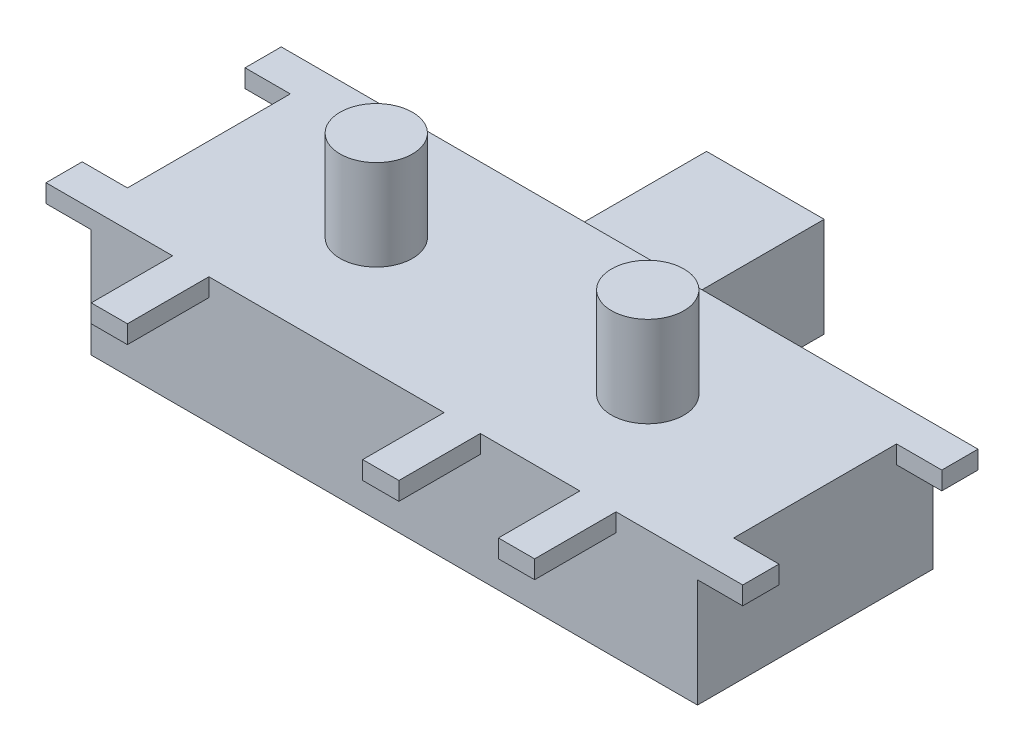
ISO-10303-21;
HEADER;
FILE_DESCRIPTION(('STEP AP214'),'2;1');
FILE_NAME('part.step','',(''),(''),'','','');
FILE_SCHEMA(('AUTOMOTIVE_DESIGN { 1 0 10303 214 1 1 1 1 }'));
ENDSEC;
DATA;
#1=APPLICATION_CONTEXT('core data for automotive mechanical design processes');
#2=APPLICATION_PROTOCOL_DEFINITION('international standard','automotive_design',2000,#1);
#3=PRODUCT_CONTEXT('',#1,'mechanical');
#4=PRODUCT('Part','Part','',(#3));
#5=PRODUCT_RELATED_PRODUCT_CATEGORY('part','',(#4));
#6=PRODUCT_DEFINITION_FORMATION('','',#4);
#7=PRODUCT_DEFINITION_CONTEXT('part definition',#1,'design');
#8=PRODUCT_DEFINITION('design','',#6,#7);
#9=PRODUCT_DEFINITION_SHAPE('','',#8);
#10=(LENGTH_UNIT() NAMED_UNIT(*) SI_UNIT(.MILLI.,.METRE.));
#11=(NAMED_UNIT(*) PLANE_ANGLE_UNIT() SI_UNIT($,.RADIAN.));
#12=(NAMED_UNIT(*) SI_UNIT($,.STERADIAN.) SOLID_ANGLE_UNIT());
#13=UNCERTAINTY_MEASURE_WITH_UNIT(LENGTH_MEASURE(1.E-05),#10,'distance_accuracy_value','');
#14=(GEOMETRIC_REPRESENTATION_CONTEXT(3) GLOBAL_UNCERTAINTY_ASSIGNED_CONTEXT((#13)) GLOBAL_UNIT_ASSIGNED_CONTEXT((#10,
#11,#12)) REPRESENTATION_CONTEXT('',''));
#15=CARTESIAN_POINT('',(0.,0.,0.));
#16=DIRECTION('',(0.,0.,1.));
#17=DIRECTION('',(1.,0.,0.));
#18=AXIS2_PLACEMENT_3D('',#15,#16,#17);
#19=CARTESIAN_POINT('',(0.,0.,-2.8));
#20=DIRECTION('',(0.,0.,-1.));
#21=DIRECTION('',(-1.,0.,0.));
#22=AXIS2_PLACEMENT_3D('',#19,#20,#21);
#23=PLANE('',#22);
#24=DIRECTION('',(0.,1.,0.));
#25=VECTOR('',#24,1.);
#26=CARTESIAN_POINT('',(-0.65,1.25,-2.8));
#27=LINE('',#26,#25);
#28=CARTESIAN_POINT('',(-0.65,0.15,-2.8));
#29=VERTEX_POINT('',#28);
#30=CARTESIAN_POINT('',(-0.65,1.25,-2.8));
#31=VERTEX_POINT('',#30);
#32=EDGE_CURVE('E223',#29,#31,#27,.T.);
#33=ORIENTED_EDGE('',*,*,#32,.T.);
#34=DIRECTION('',(1.,0.,0.));
#35=VECTOR('',#34,1.);
#36=CARTESIAN_POINT('',(0.65,1.25,-2.8));
#37=LINE('',#36,#35);
#38=CARTESIAN_POINT('',(0.65,1.25,-2.8));
#39=VERTEX_POINT('',#38);
#40=EDGE_CURVE('E246',#31,#39,#37,.T.);
#41=ORIENTED_EDGE('',*,*,#40,.T.);
#42=DIRECTION('',(0.,-1.,0.));
#43=VECTOR('',#42,1.);
#44=CARTESIAN_POINT('',(0.65,1.25,-2.8));
#45=LINE('',#44,#43);
#46=CARTESIAN_POINT('',(0.65,0.15,-2.8));
#47=VERTEX_POINT('',#46);
#48=EDGE_CURVE('E229',#39,#47,#45,.T.);
#49=ORIENTED_EDGE('',*,*,#48,.T.);
#50=DIRECTION('',(1.,0.,0.));
#51=VECTOR('',#50,1.);
#52=CARTESIAN_POINT('',(0.65,0.15,-2.8));
#53=LINE('',#52,#51);
#54=EDGE_CURVE('E226',#47,#29,#53,.F.);
#55=ORIENTED_EDGE('',*,*,#54,.T.);
#56=EDGE_LOOP('',(#33,#41,#49,#55));
#57=FACE_BOUND('',#56,.T.);
#58=ADVANCED_FACE('F17',(#57),#23,.T.);
#59=CARTESIAN_POINT('',(1.5,2.4,0.));
#60=DIRECTION('',(0.,1.,0.));
#61=DIRECTION('',(0.,0.,1.));
#62=AXIS2_PLACEMENT_3D('',#59,#60,#61);
#63=PLANE('',#62);
#64=CARTESIAN_POINT('',(1.5,2.4,0.));
#65=DIRECTION('',(0.,-1.,0.));
#66=DIRECTION('',(0.,0.,-1.));
#67=AXIS2_PLACEMENT_3D('',#64,#65,#66);
#68=CIRCLE('',#67,0.4);
#69=CARTESIAN_POINT('',(1.5,2.4,-0.4));
#70=VERTEX_POINT('',#69);
#71=EDGE_CURVE('E20',#70,#70,#68,.T.);
#72=ORIENTED_EDGE('',*,*,#71,.F.);
#73=EDGE_LOOP('',(#72));
#74=FACE_BOUND('',#73,.T.);
#75=ADVANCED_FACE('F848',(#74),#63,.T.);
#76=CARTESIAN_POINT('',(-1.5,2.4,0.));
#77=DIRECTION('',(0.,1.,0.));
#78=DIRECTION('',(0.,0.,1.));
#79=AXIS2_PLACEMENT_3D('',#76,#77,#78);
#80=PLANE('',#79);
#81=CARTESIAN_POINT('',(-1.5,2.4,0.));
#82=DIRECTION('',(0.,-1.,0.));
#83=DIRECTION('',(0.,0.,-1.));
#84=AXIS2_PLACEMENT_3D('',#81,#82,#83);
#85=CIRCLE('',#84,0.4);
#86=CARTESIAN_POINT('',(-1.5,2.4,-0.4));
#87=VERTEX_POINT('',#86);
#88=EDGE_CURVE('E257',#87,#87,#85,.T.);
#89=ORIENTED_EDGE('',*,*,#88,.F.);
#90=EDGE_LOOP('',(#89));
#91=FACE_BOUND('',#90,.T.);
#92=ADVANCED_FACE('F841',(#91),#80,.T.);
#93=CARTESIAN_POINT('',(0.,1.2,0.));
#94=DIRECTION('',(0.,1.,0.));
#95=DIRECTION('',(0.,0.,1.));
#96=AXIS2_PLACEMENT_3D('',#93,#94,#95);
#97=PLANE('',#96);
#98=DIRECTION('',(-1.,0.,0.));
#99=VECTOR('',#98,1.);
#100=CARTESIAN_POINT('',(-3.35,1.2,1.3));
#101=LINE('',#100,#99);
#102=CARTESIAN_POINT('',(-2.45,1.2,1.3));
#103=VERTEX_POINT('',#102);
#104=CARTESIAN_POINT('',(-2.05,1.2,1.3));
#105=VERTEX_POINT('',#104);
#106=EDGE_CURVE('E385',#103,#105,#101,.F.);
#107=ORIENTED_EDGE('',*,*,#106,.T.);
#108=DIRECTION('',(0.,0.,-1.));
#109=VECTOR('',#108,1.);
#110=CARTESIAN_POINT('',(-2.05,1.2,1.3));
#111=LINE('',#110,#109);
#112=CARTESIAN_POINT('',(-2.05,1.2,2.2));
#113=VERTEX_POINT('',#112);
#114=EDGE_CURVE('E398',#113,#105,#111,.T.);
#115=ORIENTED_EDGE('',*,*,#114,.F.);
#116=DIRECTION('',(1.,0.,0.));
#117=VECTOR('',#116,1.);
#118=CARTESIAN_POINT('',(-2.45,1.2,2.2));
#119=LINE('',#118,#117);
#120=CARTESIAN_POINT('',(-2.45,1.2,2.2));
#121=VERTEX_POINT('',#120);
#122=EDGE_CURVE('E404',#121,#113,#119,.T.);
#123=ORIENTED_EDGE('',*,*,#122,.F.);
#124=DIRECTION('',(0.,0.,1.));
#125=VECTOR('',#124,1.);
#126=CARTESIAN_POINT('',(-2.45,1.2,1.3));
#127=LINE('',#126,#125);
#128=EDGE_CURVE('E259',#103,#121,#127,.T.);
#129=ORIENTED_EDGE('',*,*,#128,.F.);
#130=EDGE_LOOP('',(#107,#115,#123,#129));
#131=FACE_BOUND('',#130,.T.);
#132=ADVANCED_FACE('F421',(#131),#97,.F.);
#133=CARTESIAN_POINT('',(0.,1.2,0.));
#134=DIRECTION('',(0.,1.,0.));
#135=DIRECTION('',(0.,0.,1.));
#136=AXIS2_PLACEMENT_3D('',#133,#134,#135);
#137=PLANE('',#136);
#138=DIRECTION('',(-1.,0.,0.));
#139=VECTOR('',#138,1.);
#140=CARTESIAN_POINT('',(-3.35,1.2,1.3));
#141=LINE('',#140,#139);
#142=CARTESIAN_POINT('',(0.55,1.2,1.3));
#143=VERTEX_POINT('',#142);
#144=CARTESIAN_POINT('',(0.95,1.2,1.3));
#145=VERTEX_POINT('',#144);
#146=EDGE_CURVE('E381',#143,#145,#141,.F.);
#147=ORIENTED_EDGE('',*,*,#146,.T.);
#148=DIRECTION('',(0.,0.,-1.));
#149=VECTOR('',#148,1.);
#150=CARTESIAN_POINT('',(0.95,1.2,1.3));
#151=LINE('',#150,#149);
#152=CARTESIAN_POINT('',(0.950000000000001,1.2,2.2));
#153=VERTEX_POINT('',#152);
#154=EDGE_CURVE('E361',#153,#145,#151,.T.);
#155=ORIENTED_EDGE('',*,*,#154,.F.);
#156=DIRECTION('',(1.,0.,0.));
#157=VECTOR('',#156,1.);
#158=CARTESIAN_POINT('',(0.55,1.2,2.2));
#159=LINE('',#158,#157);
#160=CARTESIAN_POINT('',(0.55,1.2,2.2));
#161=VERTEX_POINT('',#160);
#162=EDGE_CURVE('E367',#161,#153,#159,.T.);
#163=ORIENTED_EDGE('',*,*,#162,.F.);
#164=DIRECTION('',(0.,0.,1.));
#165=VECTOR('',#164,1.);
#166=CARTESIAN_POINT('',(0.55,1.2,1.3));
#167=LINE('',#166,#165);
#168=EDGE_CURVE('E372',#143,#161,#167,.T.);
#169=ORIENTED_EDGE('',*,*,#168,.F.);
#170=EDGE_LOOP('',(#147,#155,#163,#169));
#171=FACE_BOUND('',#170,.T.);
#172=ADVANCED_FACE('F621',(#171),#137,.F.);
#173=CARTESIAN_POINT('',(0.,1.2,0.));
#174=DIRECTION('',(0.,1.,0.));
#175=DIRECTION('',(0.,0.,1.));
#176=AXIS2_PLACEMENT_3D('',#173,#174,#175);
#177=PLANE('',#176);
#178=DIRECTION('',(-1.,0.,0.));
#179=VECTOR('',#178,1.);
#180=CARTESIAN_POINT('',(-3.35,1.2,1.3));
#181=LINE('',#180,#179);
#182=CARTESIAN_POINT('',(2.05,1.2,1.3));
#183=VERTEX_POINT('',#182);
#184=CARTESIAN_POINT('',(2.45,1.2,1.3));
#185=VERTEX_POINT('',#184);
#186=EDGE_CURVE('E377',#183,#185,#181,.F.);
#187=ORIENTED_EDGE('',*,*,#186,.T.);
#188=DIRECTION('',(0.,0.,-1.));
#189=VECTOR('',#188,1.);
#190=CARTESIAN_POINT('',(2.45,1.2,1.3));
#191=LINE('',#190,#189);
#192=CARTESIAN_POINT('',(2.45,1.2,2.2));
#193=VERTEX_POINT('',#192);
#194=EDGE_CURVE('E342',#193,#185,#191,.T.);
#195=ORIENTED_EDGE('',*,*,#194,.F.);
#196=DIRECTION('',(1.,0.,0.));
#197=VECTOR('',#196,1.);
#198=CARTESIAN_POINT('',(2.05,1.2,2.2));
#199=LINE('',#198,#197);
#200=CARTESIAN_POINT('',(2.05,1.2,2.2));
#201=VERTEX_POINT('',#200);
#202=EDGE_CURVE('E348',#201,#193,#199,.T.);
#203=ORIENTED_EDGE('',*,*,#202,.F.);
#204=DIRECTION('',(0.,0.,1.));
#205=VECTOR('',#204,1.);
#206=CARTESIAN_POINT('',(2.05,1.2,1.3));
#207=LINE('',#206,#205);
#208=EDGE_CURVE('E353',#183,#201,#207,.T.);
#209=ORIENTED_EDGE('',*,*,#208,.F.);
#210=EDGE_LOOP('',(#187,#195,#203,#209));
#211=FACE_BOUND('',#210,.T.);
#212=ADVANCED_FACE('F613',(#211),#177,.F.);
#213=CARTESIAN_POINT('',(0.,1.2,0.));
#214=DIRECTION('',(0.,-1.,0.));
#215=DIRECTION('',(0.,0.,-1.));
#216=AXIS2_PLACEMENT_3D('',#213,#214,#215);
#217=PLANE('',#216);
#218=DIRECTION('',(0.,0.,-1.));
#219=VECTOR('',#218,1.);
#220=CARTESIAN_POINT('',(3.85,1.2,1.3));
#221=LINE('',#220,#219);
#222=CARTESIAN_POINT('',(3.85,1.2,1.3));
#223=VERTEX_POINT('',#222);
#224=CARTESIAN_POINT('',(3.85,1.2,0.899999999999999));
#225=VERTEX_POINT('',#224);
#226=EDGE_CURVE('E334',#223,#225,#221,.T.);
#227=ORIENTED_EDGE('',*,*,#226,.F.);
#228=DIRECTION('',(-1.,0.,0.));
#229=VECTOR('',#228,1.);
#230=CARTESIAN_POINT('',(-3.35,1.2,1.3));
#231=LINE('',#230,#229);
#232=CARTESIAN_POINT('',(3.35,1.2,1.3));
#233=VERTEX_POINT('',#232);
#234=EDGE_CURVE('E394',#223,#233,#231,.T.);
#235=ORIENTED_EDGE('',*,*,#234,.T.);
#236=DIRECTION('',(0.,0.,1.));
#237=VECTOR('',#236,1.);
#238=CARTESIAN_POINT('',(3.35,1.2,-1.3));
#239=LINE('',#238,#237);
#240=CARTESIAN_POINT('',(3.35,1.2,0.899999999999999));
#241=VERTEX_POINT('',#240);
#242=EDGE_CURVE('E319',#233,#241,#239,.F.);
#243=ORIENTED_EDGE('',*,*,#242,.T.);
#244=DIRECTION('',(-1.,0.,0.));
#245=VECTOR('',#244,1.);
#246=CARTESIAN_POINT('',(3.35,1.2,0.899999999999999));
#247=LINE('',#246,#245);
#248=EDGE_CURVE('E328',#225,#241,#247,.T.);
#249=ORIENTED_EDGE('',*,*,#248,.F.);
#250=EDGE_LOOP('',(#227,#235,#243,#249));
#251=FACE_BOUND('',#250,.T.);
#252=ADVANCED_FACE('F611',(#251),#217,.T.);
#253=CARTESIAN_POINT('',(0.,1.2,0.));
#254=DIRECTION('',(0.,1.,0.));
#255=DIRECTION('',(0.,0.,1.));
#256=AXIS2_PLACEMENT_3D('',#253,#254,#255);
#257=PLANE('',#256);
#258=DIRECTION('',(1.,0.,0.));
#259=VECTOR('',#258,1.);
#260=CARTESIAN_POINT('',(-3.35,1.2,-1.3));
#261=LINE('',#260,#259);
#262=CARTESIAN_POINT('',(3.35,1.2,-1.3));
#263=VERTEX_POINT('',#262);
#264=CARTESIAN_POINT('',(3.85,1.2,-1.3));
#265=VERTEX_POINT('',#264);
#266=EDGE_CURVE('E301',#263,#265,#261,.T.);
#267=ORIENTED_EDGE('',*,*,#266,.T.);
#268=DIRECTION('',(0.,0.,-1.));
#269=VECTOR('',#268,1.);
#270=CARTESIAN_POINT('',(3.85,1.2,-1.3));
#271=LINE('',#270,#269);
#272=CARTESIAN_POINT('',(3.85,1.2,-0.900000000000001));
#273=VERTEX_POINT('',#272);
#274=EDGE_CURVE('E306',#273,#265,#271,.T.);
#275=ORIENTED_EDGE('',*,*,#274,.F.);
#276=DIRECTION('',(1.,0.,0.));
#277=VECTOR('',#276,1.);
#278=CARTESIAN_POINT('',(3.35,1.2,-0.900000000000001));
#279=LINE('',#278,#277);
#280=CARTESIAN_POINT('',(3.35,1.2,-0.900000000000001));
#281=VERTEX_POINT('',#280);
#282=EDGE_CURVE('E312',#281,#273,#279,.T.);
#283=ORIENTED_EDGE('',*,*,#282,.F.);
#284=DIRECTION('',(0.,0.,1.));
#285=VECTOR('',#284,1.);
#286=CARTESIAN_POINT('',(3.35,1.2,-1.3));
#287=LINE('',#286,#285);
#288=EDGE_CURVE('E326',#281,#263,#287,.F.);
#289=ORIENTED_EDGE('',*,*,#288,.T.);
#290=EDGE_LOOP('',(#267,#275,#283,#289));
#291=FACE_BOUND('',#290,.T.);
#292=ADVANCED_FACE('F592',(#291),#257,.F.);
#293=CARTESIAN_POINT('',(0.65,0.15,-2.8));
#294=DIRECTION('',(0.,1.,0.));
#295=DIRECTION('',(0.,0.,1.));
#296=AXIS2_PLACEMENT_3D('',#293,#294,#295);
#297=PLANE('',#296);
#298=DIRECTION('',(0.,0.,1.));
#299=VECTOR('',#298,1.);
#300=CARTESIAN_POINT('',(-0.65,0.15,-2.8));
#301=LINE('',#300,#299);
#302=CARTESIAN_POINT('',(-0.65,0.15,-1.3));
#303=VERTEX_POINT('',#302);
#304=EDGE_CURVE('E232',#303,#29,#301,.F.);
#305=ORIENTED_EDGE('',*,*,#304,.T.);
#306=ORIENTED_EDGE('',*,*,#54,.F.);
#307=DIRECTION('',(0.,0.,1.));
#308=VECTOR('',#307,1.);
#309=CARTESIAN_POINT('',(0.65,0.15,-2.8));
#310=LINE('',#309,#308);
#311=CARTESIAN_POINT('',(0.65,0.15,-1.3));
#312=VERTEX_POINT('',#311);
#313=EDGE_CURVE('E265',#47,#312,#310,.T.);
#314=ORIENTED_EDGE('',*,*,#313,.T.);
#315=DIRECTION('',(1.,0.,0.));
#316=VECTOR('',#315,1.);
#317=CARTESIAN_POINT('',(-3.35,0.15,-1.3));
#318=LINE('',#317,#316);
#319=EDGE_CURVE('E237',#312,#303,#318,.F.);
#320=ORIENTED_EDGE('',*,*,#319,.T.);
#321=EDGE_LOOP('',(#305,#306,#314,#320));
#322=FACE_BOUND('',#321,.T.);
#323=ADVANCED_FACE('F235',(#322),#297,.F.);
#324=CARTESIAN_POINT('',(-0.65,1.25,-2.8));
#325=DIRECTION('',(1.,0.,0.));
#326=DIRECTION('',(0.,1.,0.));
#327=AXIS2_PLACEMENT_3D('',#324,#325,#326);
#328=PLANE('',#327);
#329=DIRECTION('',(0.,0.,-1.));
#330=VECTOR('',#329,1.);
#331=CARTESIAN_POINT('',(-0.65,1.25,-2.8));
#332=LINE('',#331,#330);
#333=CARTESIAN_POINT('',(-0.65,1.25,-1.3));
#334=VERTEX_POINT('',#333);
#335=EDGE_CURVE('E243',#334,#31,#332,.T.);
#336=ORIENTED_EDGE('',*,*,#335,.T.);
#337=ORIENTED_EDGE('',*,*,#32,.F.);
#338=ORIENTED_EDGE('',*,*,#304,.F.);
#339=DIRECTION('',(0.,1.,0.));
#340=VECTOR('',#339,1.);
#341=CARTESIAN_POINT('',(-0.65,1.4,-1.3));
#342=LINE('',#341,#340);
#343=EDGE_CURVE('E289',#303,#334,#342,.T.);
#344=ORIENTED_EDGE('',*,*,#343,.T.);
#345=EDGE_LOOP('',(#336,#337,#338,#344));
#346=FACE_BOUND('',#345,.T.);
#347=ADVANCED_FACE('F241',(#346),#328,.F.);
#348=CARTESIAN_POINT('',(0.65,1.25,-2.8));
#349=DIRECTION('',(0.,-1.,0.));
#350=DIRECTION('',(0.,0.,-1.));
#351=AXIS2_PLACEMENT_3D('',#348,#349,#350);
#352=PLANE('',#351);
#353=DIRECTION('',(0.,0.,1.));
#354=VECTOR('',#353,1.);
#355=CARTESIAN_POINT('',(0.65,1.25,-2.8));
#356=LINE('',#355,#354);
#357=CARTESIAN_POINT('',(0.65,1.25,-1.3));
#358=VERTEX_POINT('',#357);
#359=EDGE_CURVE('E270',#358,#39,#356,.F.);
#360=ORIENTED_EDGE('',*,*,#359,.T.);
#361=ORIENTED_EDGE('',*,*,#40,.F.);
#362=ORIENTED_EDGE('',*,*,#335,.F.);
#363=DIRECTION('',(1.,0.,0.));
#364=VECTOR('',#363,1.);
#365=CARTESIAN_POINT('',(-3.35,1.25,-1.3));
#366=LINE('',#365,#364);
#367=EDGE_CURVE('E279',#334,#358,#366,.T.);
#368=ORIENTED_EDGE('',*,*,#367,.T.);
#369=EDGE_LOOP('',(#360,#361,#362,#368));
#370=FACE_BOUND('',#369,.T.);
#371=ADVANCED_FACE('F277',(#370),#352,.F.);
#372=CARTESIAN_POINT('',(0.65,1.25,-2.8));
#373=DIRECTION('',(-1.,0.,0.));
#374=DIRECTION('',(0.,-1.,0.));
#375=AXIS2_PLACEMENT_3D('',#372,#373,#374);
#376=PLANE('',#375);
#377=ORIENTED_EDGE('',*,*,#313,.F.);
#378=ORIENTED_EDGE('',*,*,#48,.F.);
#379=ORIENTED_EDGE('',*,*,#359,.F.);
#380=DIRECTION('',(0.,1.,0.));
#381=VECTOR('',#380,1.);
#382=CARTESIAN_POINT('',(0.65,1.4,-1.3));
#383=LINE('',#382,#381);
#384=EDGE_CURVE('E283',#358,#312,#383,.F.);
#385=ORIENTED_EDGE('',*,*,#384,.T.);
#386=EDGE_LOOP('',(#377,#378,#379,#385));
#387=FACE_BOUND('',#386,.T.);
#388=ADVANCED_FACE('F282',(#387),#376,.F.);
#389=CARTESIAN_POINT('',(0.,0.,0.));
#390=DIRECTION('',(0.,1.,0.));
#391=DIRECTION('',(0.,0.,1.));
#392=AXIS2_PLACEMENT_3D('',#389,#390,#391);
#393=PLANE('',#392);
#394=DIRECTION('',(-1.,0.,0.));
#395=VECTOR('',#394,1.);
#396=CARTESIAN_POINT('',(-3.35,0.,1.3));
#397=LINE('',#396,#395);
#398=CARTESIAN_POINT('',(3.35,0.,1.3));
#399=VERTEX_POINT('',#398);
#400=CARTESIAN_POINT('',(-3.35,0.,1.3));
#401=VERTEX_POINT('',#400);
#402=EDGE_CURVE('E392',#399,#401,#397,.T.);
#403=ORIENTED_EDGE('',*,*,#402,.T.);
#404=DIRECTION('',(0.,0.,-1.));
#405=VECTOR('',#404,1.);
#406=CARTESIAN_POINT('',(-3.35,0.,-1.3));
#407=LINE('',#406,#405);
#408=CARTESIAN_POINT('',(-3.35,0.,-1.3));
#409=VERTEX_POINT('',#408);
#410=EDGE_CURVE('E462',#401,#409,#407,.T.);
#411=ORIENTED_EDGE('',*,*,#410,.T.);
#412=DIRECTION('',(1.,0.,0.));
#413=VECTOR('',#412,1.);
#414=CARTESIAN_POINT('',(-3.35,0.,-1.3));
#415=LINE('',#414,#413);
#416=CARTESIAN_POINT('',(3.35,0.,-1.3));
#417=VERTEX_POINT('',#416);
#418=EDGE_CURVE('E290',#409,#417,#415,.T.);
#419=ORIENTED_EDGE('',*,*,#418,.T.);
#420=DIRECTION('',(0.,0.,1.));
#421=VECTOR('',#420,1.);
#422=CARTESIAN_POINT('',(3.35,0.,-1.3));
#423=LINE('',#422,#421);
#424=EDGE_CURVE('E324',#417,#399,#423,.T.);
#425=ORIENTED_EDGE('',*,*,#424,.T.);
#426=EDGE_LOOP('',(#403,#411,#419,#425));
#427=FACE_BOUND('',#426,.T.);
#428=ADVANCED_FACE('F596',(#427),#393,.F.);
#429=CARTESIAN_POINT('',(0.,1.2,0.));
#430=DIRECTION('',(0.,-1.,0.));
#431=DIRECTION('',(0.,0.,-1.));
#432=AXIS2_PLACEMENT_3D('',#429,#430,#431);
#433=PLANE('',#432);
#434=DIRECTION('',(0.,0.,1.));
#435=VECTOR('',#434,1.);
#436=CARTESIAN_POINT('',(-3.85,1.2,-1.3));
#437=LINE('',#436,#435);
#438=CARTESIAN_POINT('',(-3.85,1.2,-1.3));
#439=VERTEX_POINT('',#438);
#440=CARTESIAN_POINT('',(-3.85,1.2,-0.9));
#441=VERTEX_POINT('',#440);
#442=EDGE_CURVE('E473',#439,#441,#437,.T.);
#443=ORIENTED_EDGE('',*,*,#442,.F.);
#444=DIRECTION('',(1.,0.,0.));
#445=VECTOR('',#444,1.);
#446=CARTESIAN_POINT('',(-3.35,1.2,-1.3));
#447=LINE('',#446,#445);
#448=CARTESIAN_POINT('',(-3.35,1.2,-1.3));
#449=VERTEX_POINT('',#448);
#450=EDGE_CURVE('E294',#439,#449,#447,.T.);
#451=ORIENTED_EDGE('',*,*,#450,.T.);
#452=DIRECTION('',(0.,0.,-1.));
#453=VECTOR('',#452,1.);
#454=CARTESIAN_POINT('',(-3.35,1.2,-1.3));
#455=LINE('',#454,#453);
#456=CARTESIAN_POINT('',(-3.35,1.2,-0.9));
#457=VERTEX_POINT('',#456);
#458=EDGE_CURVE('E457',#449,#457,#455,.F.);
#459=ORIENTED_EDGE('',*,*,#458,.T.);
#460=DIRECTION('',(1.,0.,0.));
#461=VECTOR('',#460,1.);
#462=CARTESIAN_POINT('',(-3.35,1.2,-0.9));
#463=LINE('',#462,#461);
#464=EDGE_CURVE('E467',#441,#457,#463,.T.);
#465=ORIENTED_EDGE('',*,*,#464,.F.);
#466=EDGE_LOOP('',(#443,#451,#459,#465));
#467=FACE_BOUND('',#466,.T.);
#468=ADVANCED_FACE('F492',(#467),#433,.T.);
#469=CARTESIAN_POINT('',(0.,1.2,0.));
#470=DIRECTION('',(0.,1.,0.));
#471=DIRECTION('',(0.,0.,1.));
#472=AXIS2_PLACEMENT_3D('',#469,#470,#471);
#473=PLANE('',#472);
#474=DIRECTION('',(-1.,0.,0.));
#475=VECTOR('',#474,1.);
#476=CARTESIAN_POINT('',(-3.35,1.2,1.3));
#477=LINE('',#476,#475);
#478=CARTESIAN_POINT('',(-3.35,1.2,1.3));
#479=VERTEX_POINT('',#478);
#480=CARTESIAN_POINT('',(-3.85,1.2,1.3));
#481=VERTEX_POINT('',#480);
#482=EDGE_CURVE('E390',#479,#481,#477,.T.);
#483=ORIENTED_EDGE('',*,*,#482,.T.);
#484=DIRECTION('',(0.,0.,1.));
#485=VECTOR('',#484,1.);
#486=CARTESIAN_POINT('',(-3.85,1.2,1.3));
#487=LINE('',#486,#485);
#488=CARTESIAN_POINT('',(-3.85,1.2,0.899999999999999));
#489=VERTEX_POINT('',#488);
#490=EDGE_CURVE('E443',#489,#481,#487,.T.);
#491=ORIENTED_EDGE('',*,*,#490,.F.);
#492=DIRECTION('',(-1.,0.,0.));
#493=VECTOR('',#492,1.);
#494=CARTESIAN_POINT('',(-3.35,1.2,0.899999999999999));
#495=LINE('',#494,#493);
#496=CARTESIAN_POINT('',(-3.35,1.2,0.899999999999999));
#497=VERTEX_POINT('',#496);
#498=EDGE_CURVE('E447',#497,#489,#495,.T.);
#499=ORIENTED_EDGE('',*,*,#498,.F.);
#500=DIRECTION('',(0.,0.,-1.));
#501=VECTOR('',#500,1.);
#502=CARTESIAN_POINT('',(-3.35,1.2,-1.3));
#503=LINE('',#502,#501);
#504=EDGE_CURVE('E452',#497,#479,#503,.F.);
#505=ORIENTED_EDGE('',*,*,#504,.T.);
#506=EDGE_LOOP('',(#483,#491,#499,#505));
#507=FACE_BOUND('',#506,.T.);
#508=ADVANCED_FACE('F606',(#507),#473,.F.);
#509=CARTESIAN_POINT('',(1.5,2.4,0.));
#510=DIRECTION('',(0.,-1.,0.));
#511=DIRECTION('',(0.,0.,-1.));
#512=AXIS2_PLACEMENT_3D('',#509,#510,#511);
#513=CYLINDRICAL_SURFACE('',#512,0.4);
#514=CARTESIAN_POINT('',(1.5,1.4,0.));
#515=DIRECTION('',(0.,-1.,0.));
#516=DIRECTION('',(0.,0.,-1.));
#517=AXIS2_PLACEMENT_3D('',#514,#515,#516);
#518=CIRCLE('',#517,0.4);
#519=CARTESIAN_POINT('',(1.5,1.4,-0.4));
#520=VERTEX_POINT('',#519);
#521=EDGE_CURVE('E254',#520,#520,#518,.T.);
#522=ORIENTED_EDGE('',*,*,#521,.F.);
#523=EDGE_LOOP('',(#522));
#524=FACE_BOUND('',#523,.T.);
#525=ORIENTED_EDGE('',*,*,#71,.T.);
#526=EDGE_LOOP('',(#525));
#527=FACE_BOUND('',#526,.T.);
#528=ADVANCED_FACE('F674',(#524,#527),#513,.T.);
#529=CARTESIAN_POINT('',(-1.5,2.4,0.));
#530=DIRECTION('',(0.,-1.,0.));
#531=DIRECTION('',(0.,0.,-1.));
#532=AXIS2_PLACEMENT_3D('',#529,#530,#531);
#533=CYLINDRICAL_SURFACE('',#532,0.4);
#534=CARTESIAN_POINT('',(-1.5,1.4,0.));
#535=DIRECTION('',(0.,-1.,0.));
#536=DIRECTION('',(0.,0.,-1.));
#537=AXIS2_PLACEMENT_3D('',#534,#535,#536);
#538=CIRCLE('',#537,0.4);
#539=CARTESIAN_POINT('',(-1.5,1.4,-0.4));
#540=VERTEX_POINT('',#539);
#541=EDGE_CURVE('E250',#540,#540,#538,.T.);
#542=ORIENTED_EDGE('',*,*,#541,.F.);
#543=EDGE_LOOP('',(#542));
#544=FACE_BOUND('',#543,.T.);
#545=ORIENTED_EDGE('',*,*,#88,.T.);
#546=EDGE_LOOP('',(#545));
#547=FACE_BOUND('',#546,.T.);
#548=ADVANCED_FACE('F671',(#544,#547),#533,.T.);
#549=CARTESIAN_POINT('',(-2.45,1.2,1.3));
#550=DIRECTION('',(-1.,0.,0.));
#551=DIRECTION('',(0.,0.,1.));
#552=AXIS2_PLACEMENT_3D('',#549,#550,#551);
#553=PLANE('',#552);
#554=ORIENTED_EDGE('',*,*,#128,.T.);
#555=DIRECTION('',(0.,1.,0.));
#556=VECTOR('',#555,1.);
#557=CARTESIAN_POINT('',(-2.45,1.2,2.2));
#558=LINE('',#557,#556);
#559=CARTESIAN_POINT('',(-2.45,1.4,2.2));
#560=VERTEX_POINT('',#559);
#561=EDGE_CURVE('E262',#560,#121,#558,.F.);
#562=ORIENTED_EDGE('',*,*,#561,.F.);
#563=DIRECTION('',(0.,0.,1.));
#564=VECTOR('',#563,1.);
#565=CARTESIAN_POINT('',(-2.45,1.4,0.));
#566=LINE('',#565,#564);
#567=CARTESIAN_POINT('',(-2.45,1.4,1.3));
#568=VERTEX_POINT('',#567);
#569=EDGE_CURVE('E417',#568,#560,#566,.T.);
#570=ORIENTED_EDGE('',*,*,#569,.F.);
#571=DIRECTION('',(0.,1.,0.));
#572=VECTOR('',#571,1.);
#573=CARTESIAN_POINT('',(-2.45,1.4,1.3));
#574=LINE('',#573,#572);
#575=EDGE_CURVE('E387',#568,#103,#574,.F.);
#576=ORIENTED_EDGE('',*,*,#575,.T.);
#577=EDGE_LOOP('',(#554,#562,#570,#576));
#578=FACE_BOUND('',#577,.T.);
#579=ADVANCED_FACE('F416',(#578),#553,.T.);
#580=CARTESIAN_POINT('',(-2.45,1.2,2.2));
#581=DIRECTION('',(0.,0.,1.));
#582=DIRECTION('',(1.,0.,0.));
#583=AXIS2_PLACEMENT_3D('',#580,#581,#582);
#584=PLANE('',#583);
#585=ORIENTED_EDGE('',*,*,#122,.T.);
#586=DIRECTION('',(0.,1.,0.));
#587=VECTOR('',#586,1.);
#588=CARTESIAN_POINT('',(-2.05,1.2,2.2));
#589=LINE('',#588,#587);
#590=CARTESIAN_POINT('',(-2.05,1.4,2.2));
#591=VERTEX_POINT('',#590);
#592=EDGE_CURVE('E401',#591,#113,#589,.F.);
#593=ORIENTED_EDGE('',*,*,#592,.F.);
#594=DIRECTION('',(1.,0.,0.));
#595=VECTOR('',#594,1.);
#596=CARTESIAN_POINT('',(0.,1.4,2.2));
#597=LINE('',#596,#595);
#598=EDGE_CURVE('E412',#560,#591,#597,.T.);
#599=ORIENTED_EDGE('',*,*,#598,.F.);
#600=ORIENTED_EDGE('',*,*,#561,.T.);
#601=EDGE_LOOP('',(#585,#593,#599,#600));
#602=FACE_BOUND('',#601,.T.);
#603=ADVANCED_FACE('F408',(#602),#584,.T.);
#604=CARTESIAN_POINT('',(-2.05,1.2,1.3));
#605=DIRECTION('',(1.,0.,0.));
#606=DIRECTION('',(0.,0.,-1.));
#607=AXIS2_PLACEMENT_3D('',#604,#605,#606);
#608=PLANE('',#607);
#609=ORIENTED_EDGE('',*,*,#114,.T.);
#610=DIRECTION('',(0.,1.,0.));
#611=VECTOR('',#610,1.);
#612=CARTESIAN_POINT('',(-2.05,1.4,1.3));
#613=LINE('',#612,#611);
#614=CARTESIAN_POINT('',(-2.05,1.4,1.3));
#615=VERTEX_POINT('',#614);
#616=EDGE_CURVE('E383',#105,#615,#613,.T.);
#617=ORIENTED_EDGE('',*,*,#616,.T.);
#618=DIRECTION('',(0.,0.,1.));
#619=VECTOR('',#618,1.);
#620=CARTESIAN_POINT('',(-2.05,1.4,0.));
#621=LINE('',#620,#619);
#622=EDGE_CURVE('E427',#591,#615,#621,.F.);
#623=ORIENTED_EDGE('',*,*,#622,.F.);
#624=ORIENTED_EDGE('',*,*,#592,.T.);
#625=EDGE_LOOP('',(#609,#617,#623,#624));
#626=FACE_BOUND('',#625,.T.);
#627=ADVANCED_FACE('F425',(#626),#608,.T.);
#628=CARTESIAN_POINT('',(-3.35,1.4,1.3));
#629=DIRECTION('',(0.,0.,-1.));
#630=DIRECTION('',(-1.,0.,0.));
#631=AXIS2_PLACEMENT_3D('',#628,#629,#630);
#632=PLANE('',#631);
#633=DIRECTION('',(0.,1.,0.));
#634=VECTOR('',#633,1.);
#635=CARTESIAN_POINT('',(2.05,1.2,1.3));
#636=LINE('',#635,#634);
#637=CARTESIAN_POINT('',(2.05,1.4,1.3));
#638=VERTEX_POINT('',#637);
#639=EDGE_CURVE('E355',#638,#183,#636,.F.);
#640=ORIENTED_EDGE('',*,*,#639,.F.);
#641=DIRECTION('',(-1.,0.,0.));
#642=VECTOR('',#641,1.);
#643=CARTESIAN_POINT('',(-3.35,1.4,1.3));
#644=LINE('',#643,#642);
#645=CARTESIAN_POINT('',(0.95,1.4,1.3));
#646=VERTEX_POINT('',#645);
#647=EDGE_CURVE('E379',#646,#638,#644,.F.);
#648=ORIENTED_EDGE('',*,*,#647,.F.);
#649=DIRECTION('',(0.,1.,0.));
#650=VECTOR('',#649,1.);
#651=CARTESIAN_POINT('',(0.95,1.2,1.3));
#652=LINE('',#651,#650);
#653=EDGE_CURVE('E358',#145,#646,#652,.T.);
#654=ORIENTED_EDGE('',*,*,#653,.F.);
#655=ORIENTED_EDGE('',*,*,#146,.F.);
#656=DIRECTION('',(0.,1.,0.));
#657=VECTOR('',#656,1.);
#658=CARTESIAN_POINT('',(0.55,1.2,1.3));
#659=LINE('',#658,#657);
#660=CARTESIAN_POINT('',(0.55,1.4,1.3));
#661=VERTEX_POINT('',#660);
#662=EDGE_CURVE('E374',#661,#143,#659,.F.);
#663=ORIENTED_EDGE('',*,*,#662,.F.);
#664=DIRECTION('',(1.,0.,0.));
#665=VECTOR('',#664,1.);
#666=CARTESIAN_POINT('',(0.,1.4,1.3));
#667=LINE('',#666,#665);
#668=EDGE_CURVE('E431',#615,#661,#667,.T.);
#669=ORIENTED_EDGE('',*,*,#668,.F.);
#670=ORIENTED_EDGE('',*,*,#616,.F.);
#671=ORIENTED_EDGE('',*,*,#106,.F.);
#672=ORIENTED_EDGE('',*,*,#575,.F.);
#673=DIRECTION('',(1.,0.,0.));
#674=VECTOR('',#673,1.);
#675=CARTESIAN_POINT('',(0.,1.4,1.3));
#676=LINE('',#675,#674);
#677=CARTESIAN_POINT('',(-3.85,1.4,1.3));
#678=VERTEX_POINT('',#677);
#679=EDGE_CURVE('E253',#678,#568,#676,.T.);
#680=ORIENTED_EDGE('',*,*,#679,.F.);
#681=DIRECTION('',(0.,1.,0.));
#682=VECTOR('',#681,1.);
#683=CARTESIAN_POINT('',(-3.85,1.2,1.3));
#684=LINE('',#683,#682);
#685=EDGE_CURVE('E256',#481,#678,#684,.T.);
#686=ORIENTED_EDGE('',*,*,#685,.F.);
#687=ORIENTED_EDGE('',*,*,#482,.F.);
#688=DIRECTION('',(0.,1.,0.));
#689=VECTOR('',#688,1.);
#690=CARTESIAN_POINT('',(-3.35,1.4,1.3));
#691=LINE('',#690,#689);
#692=EDGE_CURVE('E464',#479,#401,#691,.F.);
#693=ORIENTED_EDGE('',*,*,#692,.T.);
#694=ORIENTED_EDGE('',*,*,#402,.F.);
#695=DIRECTION('',(0.,1.,0.));
#696=VECTOR('',#695,1.);
#697=CARTESIAN_POINT('',(3.35,1.4,1.3));
#698=LINE('',#697,#696);
#699=EDGE_CURVE('E321',#399,#233,#698,.T.);
#700=ORIENTED_EDGE('',*,*,#699,.T.);
#701=ORIENTED_EDGE('',*,*,#234,.F.);
#702=DIRECTION('',(0.,1.,0.));
#703=VECTOR('',#702,1.);
#704=CARTESIAN_POINT('',(3.85,1.2,1.3));
#705=LINE('',#704,#703);
#706=CARTESIAN_POINT('',(3.85,1.4,1.3));
#707=VERTEX_POINT('',#706);
#708=EDGE_CURVE('E336',#707,#223,#705,.F.);
#709=ORIENTED_EDGE('',*,*,#708,.F.);
#710=DIRECTION('',(-1.,0.,0.));
#711=VECTOR('',#710,1.);
#712=CARTESIAN_POINT('',(-3.35,1.4,1.3));
#713=LINE('',#712,#711);
#714=CARTESIAN_POINT('',(2.45,1.4,1.3));
#715=VERTEX_POINT('',#714);
#716=EDGE_CURVE('E396',#715,#707,#713,.F.);
#717=ORIENTED_EDGE('',*,*,#716,.F.);
#718=DIRECTION('',(0.,1.,0.));
#719=VECTOR('',#718,1.);
#720=CARTESIAN_POINT('',(2.45,1.2,1.3));
#721=LINE('',#720,#719);
#722=EDGE_CURVE('E339',#185,#715,#721,.T.);
#723=ORIENTED_EDGE('',*,*,#722,.F.);
#724=ORIENTED_EDGE('',*,*,#186,.F.);
#725=EDGE_LOOP('',(#640,#648,#654,#655,#663,#669,#670,#671,#672,#680,#686,#687,#693,#694,#700,
#701,#709,#717,#723,#724));
#726=FACE_BOUND('',#725,.T.);
#727=ADVANCED_FACE('F541',(#726),#632,.F.);
#728=CARTESIAN_POINT('',(0.55,1.2,1.3));
#729=DIRECTION('',(-1.,0.,0.));
#730=DIRECTION('',(0.,0.,1.));
#731=AXIS2_PLACEMENT_3D('',#728,#729,#730);
#732=PLANE('',#731);
#733=ORIENTED_EDGE('',*,*,#168,.T.);
#734=DIRECTION('',(0.,1.,0.));
#735=VECTOR('',#734,1.);
#736=CARTESIAN_POINT('',(0.55,1.2,2.2));
#737=LINE('',#736,#735);
#738=CARTESIAN_POINT('',(0.55,1.4,2.2));
#739=VERTEX_POINT('',#738);
#740=EDGE_CURVE('E369',#739,#161,#737,.F.);
#741=ORIENTED_EDGE('',*,*,#740,.F.);
#742=DIRECTION('',(0.,0.,1.));
#743=VECTOR('',#742,1.);
#744=CARTESIAN_POINT('',(0.55,1.4,0.));
#745=LINE('',#744,#743);
#746=EDGE_CURVE('E536',#661,#739,#745,.T.);
#747=ORIENTED_EDGE('',*,*,#746,.F.);
#748=ORIENTED_EDGE('',*,*,#662,.T.);
#749=EDGE_LOOP('',(#733,#741,#747,#748));
#750=FACE_BOUND('',#749,.T.);
#751=ADVANCED_FACE('F545',(#750),#732,.T.);
#752=CARTESIAN_POINT('',(0.55,1.2,2.2));
#753=DIRECTION('',(0.,0.,1.));
#754=DIRECTION('',(1.,0.,0.));
#755=AXIS2_PLACEMENT_3D('',#752,#753,#754);
#756=PLANE('',#755);
#757=ORIENTED_EDGE('',*,*,#162,.T.);
#758=DIRECTION('',(0.,1.,0.));
#759=VECTOR('',#758,1.);
#760=CARTESIAN_POINT('',(0.950000000000001,1.2,2.2));
#761=LINE('',#760,#759);
#762=CARTESIAN_POINT('',(0.950000000000001,1.4,2.2));
#763=VERTEX_POINT('',#762);
#764=EDGE_CURVE('E364',#763,#153,#761,.F.);
#765=ORIENTED_EDGE('',*,*,#764,.F.);
#766=DIRECTION('',(1.,0.,0.));
#767=VECTOR('',#766,1.);
#768=CARTESIAN_POINT('',(0.,1.4,2.2));
#769=LINE('',#768,#767);
#770=EDGE_CURVE('E533',#739,#763,#769,.T.);
#771=ORIENTED_EDGE('',*,*,#770,.F.);
#772=ORIENTED_EDGE('',*,*,#740,.T.);
#773=EDGE_LOOP('',(#757,#765,#771,#772));
#774=FACE_BOUND('',#773,.T.);
#775=ADVANCED_FACE('F549',(#774),#756,.T.);
#776=CARTESIAN_POINT('',(0.95,1.2,1.3));
#777=DIRECTION('',(1.,0.,0.));
#778=DIRECTION('',(0.,0.,-1.));
#779=AXIS2_PLACEMENT_3D('',#776,#777,#778);
#780=PLANE('',#779);
#781=ORIENTED_EDGE('',*,*,#154,.T.);
#782=ORIENTED_EDGE('',*,*,#653,.T.);
#783=DIRECTION('',(0.,0.,1.));
#784=VECTOR('',#783,1.);
#785=CARTESIAN_POINT('',(0.950000000000001,1.4,0.));
#786=LINE('',#785,#784);
#787=EDGE_CURVE('E530',#763,#646,#786,.F.);
#788=ORIENTED_EDGE('',*,*,#787,.F.);
#789=ORIENTED_EDGE('',*,*,#764,.T.);
#790=EDGE_LOOP('',(#781,#782,#788,#789));
#791=FACE_BOUND('',#790,.T.);
#792=ADVANCED_FACE('F552',(#791),#780,.T.);
#793=CARTESIAN_POINT('',(2.05,1.2,1.3));
#794=DIRECTION('',(-1.,0.,0.));
#795=DIRECTION('',(0.,0.,1.));
#796=AXIS2_PLACEMENT_3D('',#793,#794,#795);
#797=PLANE('',#796);
#798=ORIENTED_EDGE('',*,*,#208,.T.);
#799=DIRECTION('',(0.,1.,0.));
#800=VECTOR('',#799,1.);
#801=CARTESIAN_POINT('',(2.05,1.2,2.2));
#802=LINE('',#801,#800);
#803=CARTESIAN_POINT('',(2.05,1.4,2.2));
#804=VERTEX_POINT('',#803);
#805=EDGE_CURVE('E350',#804,#201,#802,.F.);
#806=ORIENTED_EDGE('',*,*,#805,.F.);
#807=DIRECTION('',(0.,0.,1.));
#808=VECTOR('',#807,1.);
#809=CARTESIAN_POINT('',(2.05,1.4,0.));
#810=LINE('',#809,#808);
#811=EDGE_CURVE('E527',#638,#804,#810,.T.);
#812=ORIENTED_EDGE('',*,*,#811,.F.);
#813=ORIENTED_EDGE('',*,*,#639,.T.);
#814=EDGE_LOOP('',(#798,#806,#812,#813));
#815=FACE_BOUND('',#814,.T.);
#816=ADVANCED_FACE('F558',(#815),#797,.T.);
#817=CARTESIAN_POINT('',(2.05,1.2,2.2));
#818=DIRECTION('',(0.,0.,1.));
#819=DIRECTION('',(1.,0.,0.));
#820=AXIS2_PLACEMENT_3D('',#817,#818,#819);
#821=PLANE('',#820);
#822=ORIENTED_EDGE('',*,*,#202,.T.);
#823=DIRECTION('',(0.,1.,0.));
#824=VECTOR('',#823,1.);
#825=CARTESIAN_POINT('',(2.45,1.2,2.2));
#826=LINE('',#825,#824);
#827=CARTESIAN_POINT('',(2.45,1.4,2.2));
#828=VERTEX_POINT('',#827);
#829=EDGE_CURVE('E345',#828,#193,#826,.F.);
#830=ORIENTED_EDGE('',*,*,#829,.F.);
#831=DIRECTION('',(1.,0.,0.));
#832=VECTOR('',#831,1.);
#833=CARTESIAN_POINT('',(0.,1.4,2.2));
#834=LINE('',#833,#832);
#835=EDGE_CURVE('E524',#804,#828,#834,.T.);
#836=ORIENTED_EDGE('',*,*,#835,.F.);
#837=ORIENTED_EDGE('',*,*,#805,.T.);
#838=EDGE_LOOP('',(#822,#830,#836,#837));
#839=FACE_BOUND('',#838,.T.);
#840=ADVANCED_FACE('F562',(#839),#821,.T.);
#841=CARTESIAN_POINT('',(2.45,1.2,1.3));
#842=DIRECTION('',(1.,0.,0.));
#843=DIRECTION('',(0.,0.,-1.));
#844=AXIS2_PLACEMENT_3D('',#841,#842,#843);
#845=PLANE('',#844);
#846=ORIENTED_EDGE('',*,*,#194,.T.);
#847=ORIENTED_EDGE('',*,*,#722,.T.);
#848=DIRECTION('',(0.,0.,1.));
#849=VECTOR('',#848,1.);
#850=CARTESIAN_POINT('',(2.45,1.4,0.));
#851=LINE('',#850,#849);
#852=EDGE_CURVE('E521',#828,#715,#851,.F.);
#853=ORIENTED_EDGE('',*,*,#852,.F.);
#854=ORIENTED_EDGE('',*,*,#829,.T.);
#855=EDGE_LOOP('',(#846,#847,#853,#854));
#856=FACE_BOUND('',#855,.T.);
#857=ADVANCED_FACE('F566',(#856),#845,.T.);
#858=CARTESIAN_POINT('',(3.85,1.2,1.3));
#859=DIRECTION('',(1.,0.,0.));
#860=DIRECTION('',(0.,0.,-1.));
#861=AXIS2_PLACEMENT_3D('',#858,#859,#860);
#862=PLANE('',#861);
#863=ORIENTED_EDGE('',*,*,#226,.T.);
#864=DIRECTION('',(0.,1.,0.));
#865=VECTOR('',#864,1.);
#866=CARTESIAN_POINT('',(3.85,1.2,0.899999999999999));
#867=LINE('',#866,#865);
#868=CARTESIAN_POINT('',(3.85,1.4,0.899999999999999));
#869=VERTEX_POINT('',#868);
#870=EDGE_CURVE('E331',#869,#225,#867,.F.);
#871=ORIENTED_EDGE('',*,*,#870,.F.);
#872=DIRECTION('',(0.,0.,1.));
#873=VECTOR('',#872,1.);
#874=CARTESIAN_POINT('',(3.85,1.4,0.));
#875=LINE('',#874,#873);
#876=EDGE_CURVE('E518',#707,#869,#875,.F.);
#877=ORIENTED_EDGE('',*,*,#876,.F.);
#878=ORIENTED_EDGE('',*,*,#708,.T.);
#879=EDGE_LOOP('',(#863,#871,#877,#878));
#880=FACE_BOUND('',#879,.T.);
#881=ADVANCED_FACE('F571',(#880),#862,.T.);
#882=CARTESIAN_POINT('',(3.35,1.2,0.899999999999999));
#883=DIRECTION('',(0.,0.,-1.));
#884=DIRECTION('',(-1.,0.,0.));
#885=AXIS2_PLACEMENT_3D('',#882,#883,#884);
#886=PLANE('',#885);
#887=ORIENTED_EDGE('',*,*,#248,.T.);
#888=DIRECTION('',(0.,1.,0.));
#889=VECTOR('',#888,1.);
#890=CARTESIAN_POINT('',(3.35,1.4,0.899999999999999));
#891=LINE('',#890,#889);
#892=CARTESIAN_POINT('',(3.35,1.4,0.899999999999999));
#893=VERTEX_POINT('',#892);
#894=EDGE_CURVE('E317',#241,#893,#891,.T.);
#895=ORIENTED_EDGE('',*,*,#894,.T.);
#896=DIRECTION('',(1.,0.,0.));
#897=VECTOR('',#896,1.);
#898=CARTESIAN_POINT('',(0.,1.4,0.899999999999999));
#899=LINE('',#898,#897);
#900=EDGE_CURVE('E515',#869,#893,#899,.F.);
#901=ORIENTED_EDGE('',*,*,#900,.F.);
#902=ORIENTED_EDGE('',*,*,#870,.T.);
#903=EDGE_LOOP('',(#887,#895,#901,#902));
#904=FACE_BOUND('',#903,.T.);
#905=ADVANCED_FACE('F575',(#904),#886,.T.);
#906=CARTESIAN_POINT('',(3.35,1.4,-1.3));
#907=DIRECTION('',(-1.,0.,0.));
#908=DIRECTION('',(0.,0.,1.));
#909=AXIS2_PLACEMENT_3D('',#906,#907,#908);
#910=PLANE('',#909);
#911=ORIENTED_EDGE('',*,*,#894,.F.);
#912=ORIENTED_EDGE('',*,*,#242,.F.);
#913=ORIENTED_EDGE('',*,*,#699,.F.);
#914=ORIENTED_EDGE('',*,*,#424,.F.);
#915=DIRECTION('',(0.,1.,0.));
#916=VECTOR('',#915,1.);
#917=CARTESIAN_POINT('',(3.35,1.4,-1.3));
#918=LINE('',#917,#916);
#919=EDGE_CURVE('E303',#417,#263,#918,.T.);
#920=ORIENTED_EDGE('',*,*,#919,.T.);
#921=ORIENTED_EDGE('',*,*,#288,.F.);
#922=DIRECTION('',(0.,1.,0.));
#923=VECTOR('',#922,1.);
#924=CARTESIAN_POINT('',(3.35,1.2,-0.900000000000001));
#925=LINE('',#924,#923);
#926=CARTESIAN_POINT('',(3.35,1.4,-0.900000000000001));
#927=VERTEX_POINT('',#926);
#928=EDGE_CURVE('E314',#927,#281,#925,.F.);
#929=ORIENTED_EDGE('',*,*,#928,.F.);
#930=DIRECTION('',(0.,0.,1.));
#931=VECTOR('',#930,1.);
#932=CARTESIAN_POINT('',(3.35,1.4,0.));
#933=LINE('',#932,#931);
#934=EDGE_CURVE('E512',#893,#927,#933,.F.);
#935=ORIENTED_EDGE('',*,*,#934,.F.);
#936=EDGE_LOOP('',(#911,#912,#913,#914,#920,#921,#929,#935));
#937=FACE_BOUND('',#936,.T.);
#938=ADVANCED_FACE('F580',(#937),#910,.F.);
#939=CARTESIAN_POINT('',(3.35,1.2,-0.900000000000001));
#940=DIRECTION('',(0.,0.,1.));
#941=DIRECTION('',(1.,0.,0.));
#942=AXIS2_PLACEMENT_3D('',#939,#940,#941);
#943=PLANE('',#942);
#944=ORIENTED_EDGE('',*,*,#282,.T.);
#945=DIRECTION('',(0.,1.,0.));
#946=VECTOR('',#945,1.);
#947=CARTESIAN_POINT('',(3.85,1.2,-0.900000000000001));
#948=LINE('',#947,#946);
#949=CARTESIAN_POINT('',(3.85,1.4,-0.900000000000001));
#950=VERTEX_POINT('',#949);
#951=EDGE_CURVE('E309',#950,#273,#948,.F.);
#952=ORIENTED_EDGE('',*,*,#951,.F.);
#953=DIRECTION('',(1.,0.,0.));
#954=VECTOR('',#953,1.);
#955=CARTESIAN_POINT('',(0.,1.4,-0.900000000000001));
#956=LINE('',#955,#954);
#957=EDGE_CURVE('E509',#927,#950,#956,.T.);
#958=ORIENTED_EDGE('',*,*,#957,.F.);
#959=ORIENTED_EDGE('',*,*,#928,.T.);
#960=EDGE_LOOP('',(#944,#952,#958,#959));
#961=FACE_BOUND('',#960,.T.);
#962=ADVANCED_FACE('F584',(#961),#943,.T.);
#963=CARTESIAN_POINT('',(3.85,1.2,-1.3));
#964=DIRECTION('',(1.,0.,0.));
#965=DIRECTION('',(0.,0.,-1.));
#966=AXIS2_PLACEMENT_3D('',#963,#964,#965);
#967=PLANE('',#966);
#968=ORIENTED_EDGE('',*,*,#274,.T.);
#969=DIRECTION('',(0.,1.,0.));
#970=VECTOR('',#969,1.);
#971=CARTESIAN_POINT('',(3.85,1.4,-1.3));
#972=LINE('',#971,#970);
#973=CARTESIAN_POINT('',(3.85,1.4,-1.3));
#974=VERTEX_POINT('',#973);
#975=EDGE_CURVE('E299',#265,#974,#972,.T.);
#976=ORIENTED_EDGE('',*,*,#975,.T.);
#977=DIRECTION('',(0.,0.,1.));
#978=VECTOR('',#977,1.);
#979=CARTESIAN_POINT('',(3.85,1.4,0.));
#980=LINE('',#979,#978);
#981=EDGE_CURVE('E504',#950,#974,#980,.F.);
#982=ORIENTED_EDGE('',*,*,#981,.F.);
#983=ORIENTED_EDGE('',*,*,#951,.T.);
#984=EDGE_LOOP('',(#968,#976,#982,#983));
#985=FACE_BOUND('',#984,.T.);
#986=ADVANCED_FACE('F588',(#985),#967,.T.);
#987=CARTESIAN_POINT('',(-3.35,1.4,-1.3));
#988=DIRECTION('',(0.,0.,1.));
#989=DIRECTION('',(1.,0.,0.));
#990=AXIS2_PLACEMENT_3D('',#987,#988,#989);
#991=PLANE('',#990);
#992=ORIENTED_EDGE('',*,*,#367,.F.);
#993=ORIENTED_EDGE('',*,*,#343,.F.);
#994=ORIENTED_EDGE('',*,*,#319,.F.);
#995=ORIENTED_EDGE('',*,*,#384,.F.);
#996=EDGE_LOOP('',(#992,#993,#994,#995));
#997=FACE_BOUND('',#996,.T.);
#998=DIRECTION('',(0.,1.,0.));
#999=VECTOR('',#998,1.);
#1000=CARTESIAN_POINT('',(-3.35,1.4,-1.3));
#1001=LINE('',#1000,#999);
#1002=EDGE_CURVE('E459',#409,#449,#1001,.T.);
#1003=ORIENTED_EDGE('',*,*,#1002,.T.);
#1004=ORIENTED_EDGE('',*,*,#450,.F.);
#1005=DIRECTION('',(0.,1.,0.));
#1006=VECTOR('',#1005,1.);
#1007=CARTESIAN_POINT('',(-3.85,1.2,-1.3));
#1008=LINE('',#1007,#1006);
#1009=CARTESIAN_POINT('',(-3.85,1.4,-1.3));
#1010=VERTEX_POINT('',#1009);
#1011=EDGE_CURVE('E285',#1010,#439,#1008,.F.);
#1012=ORIENTED_EDGE('',*,*,#1011,.F.);
#1013=DIRECTION('',(1.,0.,0.));
#1014=VECTOR('',#1013,1.);
#1015=CARTESIAN_POINT('',(0.,1.4,-1.3));
#1016=LINE('',#1015,#1014);
#1017=EDGE_CURVE('E486',#974,#1010,#1016,.F.);
#1018=ORIENTED_EDGE('',*,*,#1017,.F.);
#1019=ORIENTED_EDGE('',*,*,#975,.F.);
#1020=ORIENTED_EDGE('',*,*,#266,.F.);
#1021=ORIENTED_EDGE('',*,*,#919,.F.);
#1022=ORIENTED_EDGE('',*,*,#418,.F.);
#1023=EDGE_LOOP('',(#1003,#1004,#1012,#1018,#1019,#1020,#1021,#1022));
#1024=FACE_BOUND('',#1023,.T.);
#1025=ADVANCED_FACE('F287',(#997,#1024),#991,.F.);
#1026=CARTESIAN_POINT('',(-3.85,1.2,-1.3));
#1027=DIRECTION('',(-1.,0.,0.));
#1028=DIRECTION('',(0.,0.,1.));
#1029=AXIS2_PLACEMENT_3D('',#1026,#1027,#1028);
#1030=PLANE('',#1029);
#1031=ORIENTED_EDGE('',*,*,#442,.T.);
#1032=DIRECTION('',(0.,1.,0.));
#1033=VECTOR('',#1032,1.);
#1034=CARTESIAN_POINT('',(-3.85,1.2,-0.9));
#1035=LINE('',#1034,#1033);
#1036=CARTESIAN_POINT('',(-3.85,1.4,-0.9));
#1037=VERTEX_POINT('',#1036);
#1038=EDGE_CURVE('E470',#1037,#441,#1035,.F.);
#1039=ORIENTED_EDGE('',*,*,#1038,.F.);
#1040=DIRECTION('',(0.,0.,1.));
#1041=VECTOR('',#1040,1.);
#1042=CARTESIAN_POINT('',(-3.85,1.4,0.));
#1043=LINE('',#1042,#1041);
#1044=EDGE_CURVE('E482',#1010,#1037,#1043,.T.);
#1045=ORIENTED_EDGE('',*,*,#1044,.F.);
#1046=ORIENTED_EDGE('',*,*,#1011,.T.);
#1047=EDGE_LOOP('',(#1031,#1039,#1045,#1046));
#1048=FACE_BOUND('',#1047,.T.);
#1049=ADVANCED_FACE('F478',(#1048),#1030,.T.);
#1050=CARTESIAN_POINT('',(-3.35,1.2,-0.9));
#1051=DIRECTION('',(0.,0.,1.));
#1052=DIRECTION('',(1.,0.,0.));
#1053=AXIS2_PLACEMENT_3D('',#1050,#1051,#1052);
#1054=PLANE('',#1053);
#1055=ORIENTED_EDGE('',*,*,#464,.T.);
#1056=DIRECTION('',(0.,1.,0.));
#1057=VECTOR('',#1056,1.);
#1058=CARTESIAN_POINT('',(-3.35,1.4,-0.9));
#1059=LINE('',#1058,#1057);
#1060=CARTESIAN_POINT('',(-3.35,1.4,-0.9));
#1061=VERTEX_POINT('',#1060);
#1062=EDGE_CURVE('E455',#457,#1061,#1059,.T.);
#1063=ORIENTED_EDGE('',*,*,#1062,.T.);
#1064=DIRECTION('',(1.,0.,0.));
#1065=VECTOR('',#1064,1.);
#1066=CARTESIAN_POINT('',(0.,1.4,-0.9));
#1067=LINE('',#1066,#1065);
#1068=EDGE_CURVE('E498',#1037,#1061,#1067,.T.);
#1069=ORIENTED_EDGE('',*,*,#1068,.F.);
#1070=ORIENTED_EDGE('',*,*,#1038,.T.);
#1071=EDGE_LOOP('',(#1055,#1063,#1069,#1070));
#1072=FACE_BOUND('',#1071,.T.);
#1073=ADVANCED_FACE('F496',(#1072),#1054,.T.);
#1074=CARTESIAN_POINT('',(-3.35,1.4,-1.3));
#1075=DIRECTION('',(1.,0.,0.));
#1076=DIRECTION('',(0.,0.,-1.));
#1077=AXIS2_PLACEMENT_3D('',#1074,#1075,#1076);
#1078=PLANE('',#1077);
#1079=DIRECTION('',(0.,1.,0.));
#1080=VECTOR('',#1079,1.);
#1081=CARTESIAN_POINT('',(-3.35,1.2,0.899999999999999));
#1082=LINE('',#1081,#1080);
#1083=CARTESIAN_POINT('',(-3.35,1.4,0.899999999999999));
#1084=VERTEX_POINT('',#1083);
#1085=EDGE_CURVE('E449',#1084,#497,#1082,.F.);
#1086=ORIENTED_EDGE('',*,*,#1085,.F.);
#1087=DIRECTION('',(0.,0.,1.));
#1088=VECTOR('',#1087,1.);
#1089=CARTESIAN_POINT('',(-3.35,1.4,0.));
#1090=LINE('',#1089,#1088);
#1091=EDGE_CURVE('E501',#1061,#1084,#1090,.T.);
#1092=ORIENTED_EDGE('',*,*,#1091,.F.);
#1093=ORIENTED_EDGE('',*,*,#1062,.F.);
#1094=ORIENTED_EDGE('',*,*,#458,.F.);
#1095=ORIENTED_EDGE('',*,*,#1002,.F.);
#1096=ORIENTED_EDGE('',*,*,#410,.F.);
#1097=ORIENTED_EDGE('',*,*,#692,.F.);
#1098=ORIENTED_EDGE('',*,*,#504,.F.);
#1099=EDGE_LOOP('',(#1086,#1092,#1093,#1094,#1095,#1096,#1097,#1098));
#1100=FACE_BOUND('',#1099,.T.);
#1101=ADVANCED_FACE('F599',(#1100),#1078,.F.);
#1102=CARTESIAN_POINT('',(-3.35,1.2,0.899999999999999));
#1103=DIRECTION('',(0.,0.,-1.));
#1104=DIRECTION('',(-1.,0.,0.));
#1105=AXIS2_PLACEMENT_3D('',#1102,#1103,#1104);
#1106=PLANE('',#1105);
#1107=ORIENTED_EDGE('',*,*,#498,.T.);
#1108=DIRECTION('',(0.,1.,0.));
#1109=VECTOR('',#1108,1.);
#1110=CARTESIAN_POINT('',(-3.85,1.2,0.899999999999999));
#1111=LINE('',#1110,#1109);
#1112=CARTESIAN_POINT('',(-3.85,1.4,0.899999999999999));
#1113=VERTEX_POINT('',#1112);
#1114=EDGE_CURVE('E35',#1113,#489,#1111,.F.);
#1115=ORIENTED_EDGE('',*,*,#1114,.F.);
#1116=DIRECTION('',(1.,0.,0.));
#1117=VECTOR('',#1116,1.);
#1118=CARTESIAN_POINT('',(0.,1.4,0.899999999999999));
#1119=LINE('',#1118,#1117);
#1120=EDGE_CURVE('E26',#1084,#1113,#1119,.F.);
#1121=ORIENTED_EDGE('',*,*,#1120,.F.);
#1122=ORIENTED_EDGE('',*,*,#1085,.T.);
#1123=EDGE_LOOP('',(#1107,#1115,#1121,#1122));
#1124=FACE_BOUND('',#1123,.T.);
#1125=ADVANCED_FACE('F602',(#1124),#1106,.T.);
#1126=CARTESIAN_POINT('',(-3.85,1.2,1.3));
#1127=DIRECTION('',(-1.,0.,0.));
#1128=DIRECTION('',(0.,0.,1.));
#1129=AXIS2_PLACEMENT_3D('',#1126,#1127,#1128);
#1130=PLANE('',#1129);
#1131=ORIENTED_EDGE('',*,*,#490,.T.);
#1132=ORIENTED_EDGE('',*,*,#685,.T.);
#1133=DIRECTION('',(0.,0.,1.));
#1134=VECTOR('',#1133,1.);
#1135=CARTESIAN_POINT('',(-3.85,1.4,0.));
#1136=LINE('',#1135,#1134);
#1137=EDGE_CURVE('E11',#1113,#678,#1136,.T.);
#1138=ORIENTED_EDGE('',*,*,#1137,.F.);
#1139=ORIENTED_EDGE('',*,*,#1114,.T.);
#1140=EDGE_LOOP('',(#1131,#1132,#1138,#1139));
#1141=FACE_BOUND('',#1140,.T.);
#1142=ADVANCED_FACE('F609',(#1141),#1130,.T.);
#1143=CARTESIAN_POINT('',(0.,1.4,0.));
#1144=DIRECTION('',(0.,1.,0.));
#1145=DIRECTION('',(0.,0.,1.));
#1146=AXIS2_PLACEMENT_3D('',#1143,#1144,#1145);
#1147=PLANE('',#1146);
#1148=ORIENTED_EDGE('',*,*,#1120,.T.);
#1149=ORIENTED_EDGE('',*,*,#1137,.T.);
#1150=ORIENTED_EDGE('',*,*,#679,.T.);
#1151=ORIENTED_EDGE('',*,*,#569,.T.);
#1152=ORIENTED_EDGE('',*,*,#598,.T.);
#1153=ORIENTED_EDGE('',*,*,#622,.T.);
#1154=ORIENTED_EDGE('',*,*,#668,.T.);
#1155=ORIENTED_EDGE('',*,*,#746,.T.);
#1156=ORIENTED_EDGE('',*,*,#770,.T.);
#1157=ORIENTED_EDGE('',*,*,#787,.T.);
#1158=ORIENTED_EDGE('',*,*,#647,.T.);
#1159=ORIENTED_EDGE('',*,*,#811,.T.);
#1160=ORIENTED_EDGE('',*,*,#835,.T.);
#1161=ORIENTED_EDGE('',*,*,#852,.T.);
#1162=ORIENTED_EDGE('',*,*,#716,.T.);
#1163=ORIENTED_EDGE('',*,*,#876,.T.);
#1164=ORIENTED_EDGE('',*,*,#900,.T.);
#1165=ORIENTED_EDGE('',*,*,#934,.T.);
#1166=ORIENTED_EDGE('',*,*,#957,.T.);
#1167=ORIENTED_EDGE('',*,*,#981,.T.);
#1168=ORIENTED_EDGE('',*,*,#1017,.T.);
#1169=ORIENTED_EDGE('',*,*,#1044,.T.);
#1170=ORIENTED_EDGE('',*,*,#1068,.T.);
#1171=ORIENTED_EDGE('',*,*,#1091,.T.);
#1172=EDGE_LOOP('',(#1148,#1149,#1150,#1151,#1152,#1153,#1154,#1155,#1156,#1157,#1158,#1159,
#1160,#1161,#1162,#1163,#1164,#1165,#1166,#1167,#1168,#1169,#1170,#1171));
#1173=FACE_BOUND('',#1172,.T.);
#1174=ORIENTED_EDGE('',*,*,#541,.T.);
#1175=EDGE_LOOP('',(#1174));
#1176=FACE_BOUND('',#1175,.T.);
#1177=ORIENTED_EDGE('',*,*,#521,.T.);
#1178=EDGE_LOOP('',(#1177));
#1179=FACE_BOUND('',#1178,.T.);
#1180=ADVANCED_FACE('F434',(#1173,#1176,#1179),#1147,.T.);
#1181=CLOSED_SHELL('',(#58,#75,#92,#132,#172,#212,#252,#292,#323,#347,#371,#388,#428,#468,#508,
#528,#548,#579,#603,#627,#727,#751,#775,#792,#816,#840,#857,#881,#905,#938,#962,#986,#1025,
#1049,#1073,#1101,#1125,#1142,#1180));
#1182=MANIFOLD_SOLID_BREP('B1',#1181);
#1183=ADVANCED_BREP_SHAPE_REPRESENTATION('',(#18,#1182),#14);
#1184=SHAPE_DEFINITION_REPRESENTATION(#9,#1183);
ENDSEC;
END-ISO-10303-21;
